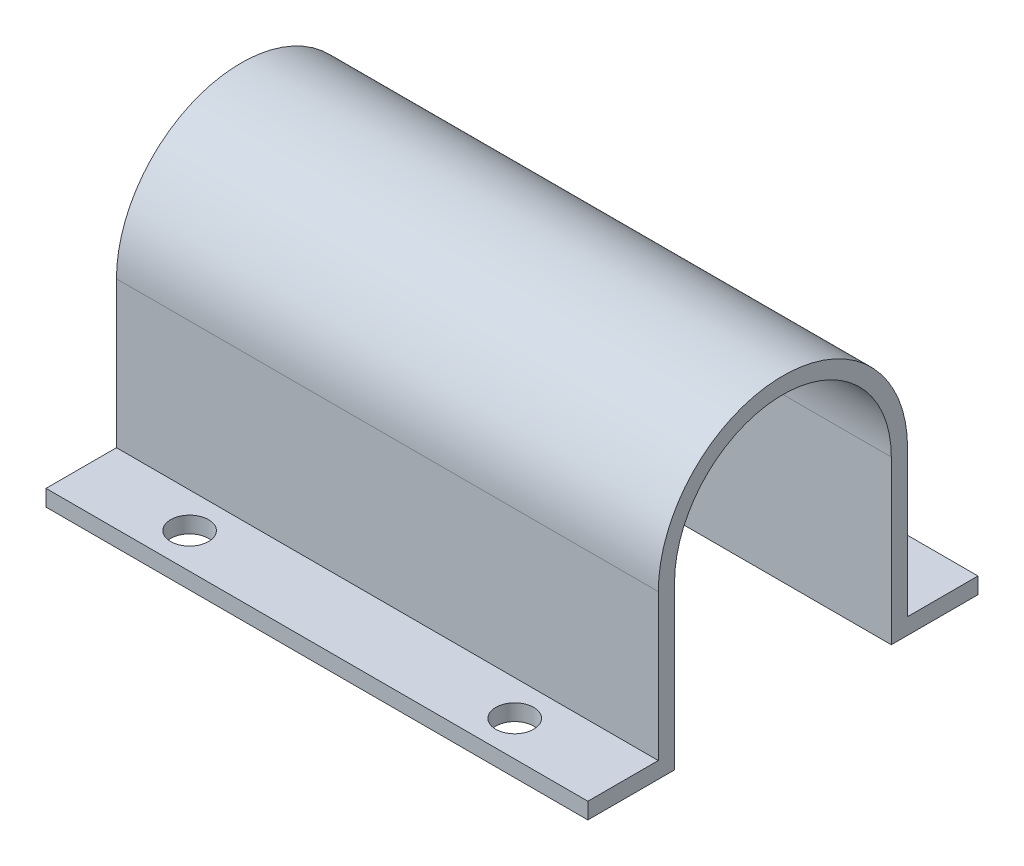
ISO-10303-21;
HEADER;
FILE_DESCRIPTION(('STEP AP214'),'2;1');
FILE_NAME('part.step','',(''),(''),'','','');
FILE_SCHEMA(('AUTOMOTIVE_DESIGN { 1 0 10303 214 1 1 1 1 }'));
ENDSEC;
DATA;
#1=APPLICATION_CONTEXT('core data for automotive mechanical design processes');
#2=APPLICATION_PROTOCOL_DEFINITION('international standard','automotive_design',2000,#1);
#3=PRODUCT_CONTEXT('',#1,'mechanical');
#4=PRODUCT('Part','Part','',(#3));
#5=PRODUCT_RELATED_PRODUCT_CATEGORY('part','',(#4));
#6=PRODUCT_DEFINITION_FORMATION('','',#4);
#7=PRODUCT_DEFINITION_CONTEXT('part definition',#1,'design');
#8=PRODUCT_DEFINITION('design','',#6,#7);
#9=PRODUCT_DEFINITION_SHAPE('','',#8);
#10=(LENGTH_UNIT() NAMED_UNIT(*) SI_UNIT(.MILLI.,.METRE.));
#11=(NAMED_UNIT(*) PLANE_ANGLE_UNIT() SI_UNIT($,.RADIAN.));
#12=(NAMED_UNIT(*) SI_UNIT($,.STERADIAN.) SOLID_ANGLE_UNIT());
#13=UNCERTAINTY_MEASURE_WITH_UNIT(LENGTH_MEASURE(1.E-05),#10,'distance_accuracy_value','');
#14=(GEOMETRIC_REPRESENTATION_CONTEXT(3) GLOBAL_UNCERTAINTY_ASSIGNED_CONTEXT((#13)) GLOBAL_UNIT_ASSIGNED_CONTEXT((#10,
#11,#12)) REPRESENTATION_CONTEXT('',''));
#15=CARTESIAN_POINT('',(0.,0.,0.));
#16=DIRECTION('',(0.,0.,1.));
#17=DIRECTION('',(1.,0.,0.));
#18=AXIS2_PLACEMENT_3D('',#15,#16,#17);
#19=CARTESIAN_POINT('',(25.,15.,11.5));
#20=DIRECTION('',(0.,0.,-1.));
#21=DIRECTION('',(-1.,0.,0.));
#22=AXIS2_PLACEMENT_3D('',#19,#20,#21);
#23=PLANE('',#22);
#24=DIRECTION('',(0.,-1.,0.));
#25=VECTOR('',#24,1.);
#26=CARTESIAN_POINT('',(-25.,15.,11.5));
#27=LINE('',#26,#25);
#28=CARTESIAN_POINT('',(-25.,15.,11.5));
#29=VERTEX_POINT('',#28);
#30=CARTESIAN_POINT('',(-25.,1.5,11.5));
#31=VERTEX_POINT('',#30);
#32=EDGE_CURVE('E157',#29,#31,#27,.T.);
#33=ORIENTED_EDGE('',*,*,#32,.T.);
#34=DIRECTION('',(-1.,0.,0.));
#35=VECTOR('',#34,1.);
#36=CARTESIAN_POINT('',(25.,1.5,11.5));
#37=LINE('',#36,#35);
#38=CARTESIAN_POINT('',(25.,1.5,11.5));
#39=VERTEX_POINT('',#38);
#40=EDGE_CURVE('E11',#39,#31,#37,.T.);
#41=ORIENTED_EDGE('',*,*,#40,.F.);
#42=DIRECTION('',(0.,-1.,0.));
#43=VECTOR('',#42,1.);
#44=CARTESIAN_POINT('',(25.,15.,11.5));
#45=LINE('',#44,#43);
#46=CARTESIAN_POINT('',(25.,15.,11.5));
#47=VERTEX_POINT('',#46);
#48=EDGE_CURVE('E180',#47,#39,#45,.T.);
#49=ORIENTED_EDGE('',*,*,#48,.F.);
#50=DIRECTION('',(-1.,0.,0.));
#51=VECTOR('',#50,1.);
#52=CARTESIAN_POINT('',(25.,15.,11.5));
#53=LINE('',#52,#51);
#54=EDGE_CURVE('E153',#47,#29,#53,.T.);
#55=ORIENTED_EDGE('',*,*,#54,.T.);
#56=EDGE_LOOP('',(#33,#41,#49,#55));
#57=FACE_BOUND('',#56,.T.);
#58=ADVANCED_FACE('F37',(#57),#23,.F.);
#59=CARTESIAN_POINT('',(25.,1.5,11.5));
#60=DIRECTION('',(0.,-1.,0.));
#61=DIRECTION('',(0.,0.,-1.));
#62=AXIS2_PLACEMENT_3D('',#59,#60,#61);
#63=PLANE('',#62);
#64=CARTESIAN_POINT('',(15.,1.5,14.75));
#65=DIRECTION('',(0.,-1.,0.));
#66=DIRECTION('',(0.,0.,1.));
#67=AXIS2_PLACEMENT_3D('',#64,#65,#66);
#68=CIRCLE('',#67,1.75);
#69=CARTESIAN_POINT('',(15.,1.5,16.5));
#70=VERTEX_POINT('',#69);
#71=EDGE_CURVE('E323',#70,#70,#68,.T.);
#72=ORIENTED_EDGE('',*,*,#71,.T.);
#73=EDGE_LOOP('',(#72));
#74=FACE_BOUND('',#73,.T.);
#75=CARTESIAN_POINT('',(-15.,1.5,14.75));
#76=DIRECTION('',(0.,1.,0.));
#77=DIRECTION('',(0.,0.,1.));
#78=AXIS2_PLACEMENT_3D('',#75,#76,#77);
#79=CIRCLE('',#78,1.75);
#80=CARTESIAN_POINT('',(-15.,1.5,16.5));
#81=VERTEX_POINT('',#80);
#82=EDGE_CURVE('E300',#81,#81,#79,.T.);
#83=ORIENTED_EDGE('',*,*,#82,.F.);
#84=EDGE_LOOP('',(#83));
#85=FACE_BOUND('',#84,.T.);
#86=DIRECTION('',(0.,0.,1.));
#87=VECTOR('',#86,1.);
#88=CARTESIAN_POINT('',(-25.,1.5,11.5));
#89=LINE('',#88,#87);
#90=CARTESIAN_POINT('',(-25.,1.5,18.));
#91=VERTEX_POINT('',#90);
#92=EDGE_CURVE('E160',#31,#91,#89,.T.);
#93=ORIENTED_EDGE('',*,*,#92,.T.);
#94=DIRECTION('',(-1.,0.,0.));
#95=VECTOR('',#94,1.);
#96=CARTESIAN_POINT('',(25.,1.5,18.));
#97=LINE('',#96,#95);
#98=CARTESIAN_POINT('',(25.,1.5,18.));
#99=VERTEX_POINT('',#98);
#100=EDGE_CURVE('E45',#99,#91,#97,.T.);
#101=ORIENTED_EDGE('',*,*,#100,.F.);
#102=DIRECTION('',(0.,0.,1.));
#103=VECTOR('',#102,1.);
#104=CARTESIAN_POINT('',(25.,1.5,11.5));
#105=LINE('',#104,#103);
#106=EDGE_CURVE('E108',#39,#99,#105,.T.);
#107=ORIENTED_EDGE('',*,*,#106,.F.);
#108=ORIENTED_EDGE('',*,*,#40,.T.);
#109=EDGE_LOOP('',(#93,#101,#107,#108));
#110=FACE_BOUND('',#109,.T.);
#111=ADVANCED_FACE('F258',(#74,#85,#110),#63,.F.);
#112=CARTESIAN_POINT('',(25.,1.5,18.));
#113=DIRECTION('',(0.,0.,-1.));
#114=DIRECTION('',(-1.,0.,0.));
#115=AXIS2_PLACEMENT_3D('',#112,#113,#114);
#116=PLANE('',#115);
#117=DIRECTION('',(0.,-1.,0.));
#118=VECTOR('',#117,1.);
#119=CARTESIAN_POINT('',(-25.,1.5,18.));
#120=LINE('',#119,#118);
#121=CARTESIAN_POINT('',(-25.,0.,18.));
#122=VERTEX_POINT('',#121);
#123=EDGE_CURVE('E163',#91,#122,#120,.T.);
#124=ORIENTED_EDGE('',*,*,#123,.T.);
#125=DIRECTION('',(-1.,0.,0.));
#126=VECTOR('',#125,1.);
#127=CARTESIAN_POINT('',(25.,0.,18.));
#128=LINE('',#127,#126);
#129=CARTESIAN_POINT('',(25.,0.,18.));
#130=VERTEX_POINT('',#129);
#131=EDGE_CURVE('E199',#130,#122,#128,.T.);
#132=ORIENTED_EDGE('',*,*,#131,.F.);
#133=DIRECTION('',(0.,-1.,0.));
#134=VECTOR('',#133,1.);
#135=CARTESIAN_POINT('',(25.,1.5,18.));
#136=LINE('',#135,#134);
#137=EDGE_CURVE('E207',#99,#130,#136,.T.);
#138=ORIENTED_EDGE('',*,*,#137,.F.);
#139=ORIENTED_EDGE('',*,*,#100,.T.);
#140=EDGE_LOOP('',(#124,#132,#138,#139));
#141=FACE_BOUND('',#140,.T.);
#142=ADVANCED_FACE('F205',(#141),#116,.F.);
#143=CARTESIAN_POINT('',(25.,0.,10.));
#144=DIRECTION('',(0.,1.,0.));
#145=DIRECTION('',(0.,0.,1.));
#146=AXIS2_PLACEMENT_3D('',#143,#144,#145);
#147=PLANE('',#146);
#148=CARTESIAN_POINT('',(15.,0.,14.75));
#149=DIRECTION('',(0.,-1.,0.));
#150=DIRECTION('',(0.,0.,1.));
#151=AXIS2_PLACEMENT_3D('',#148,#149,#150);
#152=CIRCLE('',#151,1.75);
#153=CARTESIAN_POINT('',(15.,0.,16.5));
#154=VERTEX_POINT('',#153);
#155=EDGE_CURVE('E319',#154,#154,#152,.T.);
#156=ORIENTED_EDGE('',*,*,#155,.F.);
#157=EDGE_LOOP('',(#156));
#158=FACE_BOUND('',#157,.T.);
#159=CARTESIAN_POINT('',(-15.,0.,14.75));
#160=DIRECTION('',(0.,1.,0.));
#161=DIRECTION('',(0.,0.,1.));
#162=AXIS2_PLACEMENT_3D('',#159,#160,#161);
#163=CIRCLE('',#162,1.75);
#164=CARTESIAN_POINT('',(-15.,0.,16.5));
#165=VERTEX_POINT('',#164);
#166=EDGE_CURVE('E305',#165,#165,#163,.T.);
#167=ORIENTED_EDGE('',*,*,#166,.T.);
#168=EDGE_LOOP('',(#167));
#169=FACE_BOUND('',#168,.T.);
#170=DIRECTION('',(0.,0.,-1.));
#171=VECTOR('',#170,1.);
#172=CARTESIAN_POINT('',(-25.,0.,10.));
#173=LINE('',#172,#171);
#174=CARTESIAN_POINT('',(-25.,0.,10.));
#175=VERTEX_POINT('',#174);
#176=EDGE_CURVE('E165',#122,#175,#173,.T.);
#177=ORIENTED_EDGE('',*,*,#176,.T.);
#178=DIRECTION('',(-1.,0.,0.));
#179=VECTOR('',#178,1.);
#180=CARTESIAN_POINT('',(25.,0.,10.));
#181=LINE('',#180,#179);
#182=CARTESIAN_POINT('',(25.,0.,10.));
#183=VERTEX_POINT('',#182);
#184=EDGE_CURVE('E196',#183,#175,#181,.T.);
#185=ORIENTED_EDGE('',*,*,#184,.F.);
#186=DIRECTION('',(0.,0.,-1.));
#187=VECTOR('',#186,1.);
#188=CARTESIAN_POINT('',(25.,0.,10.));
#189=LINE('',#188,#187);
#190=EDGE_CURVE('E225',#130,#183,#189,.T.);
#191=ORIENTED_EDGE('',*,*,#190,.F.);
#192=ORIENTED_EDGE('',*,*,#131,.T.);
#193=EDGE_LOOP('',(#177,#185,#191,#192));
#194=FACE_BOUND('',#193,.T.);
#195=ADVANCED_FACE('F216',(#158,#169,#194),#147,.F.);
#196=CARTESIAN_POINT('',(25.,15.,10.));
#197=DIRECTION('',(0.,0.,1.));
#198=DIRECTION('',(0.,-1.,0.));
#199=AXIS2_PLACEMENT_3D('',#196,#197,#198);
#200=PLANE('',#199);
#201=DIRECTION('',(0.,1.,0.));
#202=VECTOR('',#201,1.);
#203=CARTESIAN_POINT('',(-25.,15.,10.));
#204=LINE('',#203,#202);
#205=CARTESIAN_POINT('',(-25.,15.,10.));
#206=VERTEX_POINT('',#205);
#207=EDGE_CURVE('E167',#175,#206,#204,.T.);
#208=ORIENTED_EDGE('',*,*,#207,.T.);
#209=DIRECTION('',(-1.,0.,0.));
#210=VECTOR('',#209,1.);
#211=CARTESIAN_POINT('',(25.,15.,10.));
#212=LINE('',#211,#210);
#213=CARTESIAN_POINT('',(25.,15.,10.));
#214=VERTEX_POINT('',#213);
#215=EDGE_CURVE('E193',#214,#206,#212,.T.);
#216=ORIENTED_EDGE('',*,*,#215,.F.);
#217=DIRECTION('',(0.,1.,0.));
#218=VECTOR('',#217,1.);
#219=CARTESIAN_POINT('',(25.,15.,10.));
#220=LINE('',#219,#218);
#221=EDGE_CURVE('E222',#183,#214,#220,.T.);
#222=ORIENTED_EDGE('',*,*,#221,.F.);
#223=ORIENTED_EDGE('',*,*,#184,.T.);
#224=EDGE_LOOP('',(#208,#216,#222,#223));
#225=FACE_BOUND('',#224,.T.);
#226=ADVANCED_FACE('F220',(#225),#200,.F.);
#227=CARTESIAN_POINT('',(25.,15.,0.));
#228=DIRECTION('',(-1.,0.,0.));
#229=DIRECTION('',(0.,0.,1.));
#230=AXIS2_PLACEMENT_3D('',#227,#228,#229);
#231=CYLINDRICAL_SURFACE('',#230,10.);
#232=CARTESIAN_POINT('',(-25.,15.,0.));
#233=DIRECTION('',(-1.,0.,0.));
#234=DIRECTION('',(0.,0.,-1.));
#235=AXIS2_PLACEMENT_3D('',#232,#233,#234);
#236=CIRCLE('',#235,10.);
#237=CARTESIAN_POINT('',(-25.,15.,-10.));
#238=VERTEX_POINT('',#237);
#239=EDGE_CURVE('E169',#206,#238,#236,.T.);
#240=ORIENTED_EDGE('',*,*,#239,.T.);
#241=DIRECTION('',(-1.,0.,0.));
#242=VECTOR('',#241,1.);
#243=CARTESIAN_POINT('',(25.,15.,-10.));
#244=LINE('',#243,#242);
#245=CARTESIAN_POINT('',(25.,15.,-10.));
#246=VERTEX_POINT('',#245);
#247=EDGE_CURVE('E190',#246,#238,#244,.T.);
#248=ORIENTED_EDGE('',*,*,#247,.F.);
#249=CARTESIAN_POINT('',(25.,15.,0.));
#250=DIRECTION('',(-1.,0.,0.));
#251=DIRECTION('',(0.,0.,-1.));
#252=AXIS2_PLACEMENT_3D('',#249,#250,#251);
#253=CIRCLE('',#252,10.);
#254=EDGE_CURVE('E224',#214,#246,#253,.T.);
#255=ORIENTED_EDGE('',*,*,#254,.F.);
#256=ORIENTED_EDGE('',*,*,#215,.T.);
#257=EDGE_LOOP('',(#240,#248,#255,#256));
#258=FACE_BOUND('',#257,.T.);
#259=ADVANCED_FACE('F275',(#258),#231,.F.);
#260=CARTESIAN_POINT('',(25.,15.,-10.));
#261=DIRECTION('',(0.,0.,-1.));
#262=DIRECTION('',(0.,1.,0.));
#263=AXIS2_PLACEMENT_3D('',#260,#261,#262);
#264=PLANE('',#263);
#265=DIRECTION('',(0.,-1.,0.));
#266=VECTOR('',#265,1.);
#267=CARTESIAN_POINT('',(-25.,15.,-10.));
#268=LINE('',#267,#266);
#269=CARTESIAN_POINT('',(-25.,0.,-10.));
#270=VERTEX_POINT('',#269);
#271=EDGE_CURVE('E171',#238,#270,#268,.T.);
#272=ORIENTED_EDGE('',*,*,#271,.T.);
#273=DIRECTION('',(-1.,0.,0.));
#274=VECTOR('',#273,1.);
#275=CARTESIAN_POINT('',(25.,0.,-10.));
#276=LINE('',#275,#274);
#277=CARTESIAN_POINT('',(25.,0.,-10.));
#278=VERTEX_POINT('',#277);
#279=EDGE_CURVE('E187',#278,#270,#276,.T.);
#280=ORIENTED_EDGE('',*,*,#279,.F.);
#281=DIRECTION('',(0.,-1.,0.));
#282=VECTOR('',#281,1.);
#283=CARTESIAN_POINT('',(25.,15.,-10.));
#284=LINE('',#283,#282);
#285=EDGE_CURVE('E227',#246,#278,#284,.T.);
#286=ORIENTED_EDGE('',*,*,#285,.F.);
#287=ORIENTED_EDGE('',*,*,#247,.T.);
#288=EDGE_LOOP('',(#272,#280,#286,#287));
#289=FACE_BOUND('',#288,.T.);
#290=ADVANCED_FACE('F278',(#289),#264,.F.);
#291=CARTESIAN_POINT('',(25.,0.,-10.));
#292=DIRECTION('',(0.,1.,0.));
#293=DIRECTION('',(0.,0.,1.));
#294=AXIS2_PLACEMENT_3D('',#291,#292,#293);
#295=PLANE('',#294);
#296=CARTESIAN_POINT('',(15.,0.,-14.75));
#297=DIRECTION('',(0.,-1.,0.));
#298=DIRECTION('',(0.,0.,1.));
#299=AXIS2_PLACEMENT_3D('',#296,#297,#298);
#300=CIRCLE('',#299,1.75);
#301=CARTESIAN_POINT('',(15.,0.,-13.));
#302=VERTEX_POINT('',#301);
#303=EDGE_CURVE('E311',#302,#302,#300,.T.);
#304=ORIENTED_EDGE('',*,*,#303,.F.);
#305=EDGE_LOOP('',(#304));
#306=FACE_BOUND('',#305,.T.);
#307=CARTESIAN_POINT('',(-15.,0.,-14.75));
#308=DIRECTION('',(0.,1.,0.));
#309=DIRECTION('',(0.,0.,1.));
#310=AXIS2_PLACEMENT_3D('',#307,#308,#309);
#311=CIRCLE('',#310,1.75);
#312=CARTESIAN_POINT('',(-15.,0.,-13.));
#313=VERTEX_POINT('',#312);
#314=EDGE_CURVE('E161',#313,#313,#311,.T.);
#315=ORIENTED_EDGE('',*,*,#314,.T.);
#316=EDGE_LOOP('',(#315));
#317=FACE_BOUND('',#316,.T.);
#318=DIRECTION('',(0.,0.,-1.));
#319=VECTOR('',#318,1.);
#320=CARTESIAN_POINT('',(-25.,0.,-10.));
#321=LINE('',#320,#319);
#322=CARTESIAN_POINT('',(-25.,0.,-18.));
#323=VERTEX_POINT('',#322);
#324=EDGE_CURVE('E173',#270,#323,#321,.T.);
#325=ORIENTED_EDGE('',*,*,#324,.T.);
#326=DIRECTION('',(-1.,0.,0.));
#327=VECTOR('',#326,1.);
#328=CARTESIAN_POINT('',(25.,0.,-18.));
#329=LINE('',#328,#327);
#330=CARTESIAN_POINT('',(25.,0.,-18.));
#331=VERTEX_POINT('',#330);
#332=EDGE_CURVE('E184',#331,#323,#329,.T.);
#333=ORIENTED_EDGE('',*,*,#332,.F.);
#334=DIRECTION('',(0.,0.,-1.));
#335=VECTOR('',#334,1.);
#336=CARTESIAN_POINT('',(25.,0.,-10.));
#337=LINE('',#336,#335);
#338=EDGE_CURVE('E233',#278,#331,#337,.T.);
#339=ORIENTED_EDGE('',*,*,#338,.F.);
#340=ORIENTED_EDGE('',*,*,#279,.T.);
#341=EDGE_LOOP('',(#325,#333,#339,#340));
#342=FACE_BOUND('',#341,.T.);
#343=ADVANCED_FACE('F239',(#306,#317,#342),#295,.F.);
#344=CARTESIAN_POINT('',(25.,1.5,-18.));
#345=DIRECTION('',(0.,0.,1.));
#346=DIRECTION('',(1.,0.,0.));
#347=AXIS2_PLACEMENT_3D('',#344,#345,#346);
#348=PLANE('',#347);
#349=DIRECTION('',(0.,1.,0.));
#350=VECTOR('',#349,1.);
#351=CARTESIAN_POINT('',(-25.,1.5,-18.));
#352=LINE('',#351,#350);
#353=CARTESIAN_POINT('',(-25.,1.5,-18.));
#354=VERTEX_POINT('',#353);
#355=EDGE_CURVE('E175',#323,#354,#352,.T.);
#356=ORIENTED_EDGE('',*,*,#355,.T.);
#357=DIRECTION('',(-1.,0.,0.));
#358=VECTOR('',#357,1.);
#359=CARTESIAN_POINT('',(25.,1.5,-18.));
#360=LINE('',#359,#358);
#361=CARTESIAN_POINT('',(25.,1.5,-18.));
#362=VERTEX_POINT('',#361);
#363=EDGE_CURVE('E148',#362,#354,#360,.T.);
#364=ORIENTED_EDGE('',*,*,#363,.F.);
#365=DIRECTION('',(0.,1.,0.));
#366=VECTOR('',#365,1.);
#367=CARTESIAN_POINT('',(25.,1.5,-18.));
#368=LINE('',#367,#366);
#369=EDGE_CURVE('E139',#331,#362,#368,.T.);
#370=ORIENTED_EDGE('',*,*,#369,.F.);
#371=ORIENTED_EDGE('',*,*,#332,.T.);
#372=EDGE_LOOP('',(#356,#364,#370,#371));
#373=FACE_BOUND('',#372,.T.);
#374=ADVANCED_FACE('F243',(#373),#348,.F.);
#375=CARTESIAN_POINT('',(25.,1.5,-11.5));
#376=DIRECTION('',(0.,-1.,0.));
#377=DIRECTION('',(0.,0.,-1.));
#378=AXIS2_PLACEMENT_3D('',#375,#376,#377);
#379=PLANE('',#378);
#380=CARTESIAN_POINT('',(15.,1.5,-14.75));
#381=DIRECTION('',(0.,-1.,0.));
#382=DIRECTION('',(0.,0.,1.));
#383=AXIS2_PLACEMENT_3D('',#380,#381,#382);
#384=CIRCLE('',#383,1.75);
#385=CARTESIAN_POINT('',(15.,1.5,-13.));
#386=VERTEX_POINT('',#385);
#387=EDGE_CURVE('E295',#386,#386,#384,.T.);
#388=ORIENTED_EDGE('',*,*,#387,.T.);
#389=EDGE_LOOP('',(#388));
#390=FACE_BOUND('',#389,.T.);
#391=CARTESIAN_POINT('',(-15.,1.5,-14.75));
#392=DIRECTION('',(0.,1.,0.));
#393=DIRECTION('',(0.,0.,1.));
#394=AXIS2_PLACEMENT_3D('',#391,#392,#393);
#395=CIRCLE('',#394,1.75);
#396=CARTESIAN_POINT('',(-15.,1.5,-13.));
#397=VERTEX_POINT('',#396);
#398=EDGE_CURVE('E298',#397,#397,#395,.T.);
#399=ORIENTED_EDGE('',*,*,#398,.F.);
#400=EDGE_LOOP('',(#399));
#401=FACE_BOUND('',#400,.T.);
#402=DIRECTION('',(0.,0.,1.));
#403=VECTOR('',#402,1.);
#404=CARTESIAN_POINT('',(-25.,1.5,-11.5));
#405=LINE('',#404,#403);
#406=CARTESIAN_POINT('',(-25.,1.5,-11.5));
#407=VERTEX_POINT('',#406);
#408=EDGE_CURVE('E147',#354,#407,#405,.T.);
#409=ORIENTED_EDGE('',*,*,#408,.T.);
#410=DIRECTION('',(-1.,0.,0.));
#411=VECTOR('',#410,1.);
#412=CARTESIAN_POINT('',(25.,1.5,-11.5));
#413=LINE('',#412,#411);
#414=CARTESIAN_POINT('',(25.,1.5,-11.5));
#415=VERTEX_POINT('',#414);
#416=EDGE_CURVE('E144',#415,#407,#413,.T.);
#417=ORIENTED_EDGE('',*,*,#416,.F.);
#418=DIRECTION('',(0.,0.,1.));
#419=VECTOR('',#418,1.);
#420=CARTESIAN_POINT('',(25.,1.5,-11.5));
#421=LINE('',#420,#419);
#422=EDGE_CURVE('E133',#362,#415,#421,.T.);
#423=ORIENTED_EDGE('',*,*,#422,.F.);
#424=ORIENTED_EDGE('',*,*,#363,.T.);
#425=EDGE_LOOP('',(#409,#417,#423,#424));
#426=FACE_BOUND('',#425,.T.);
#427=ADVANCED_FACE('F145',(#390,#401,#426),#379,.F.);
#428=CARTESIAN_POINT('',(25.,15.,-11.5));
#429=DIRECTION('',(0.,0.,1.));
#430=DIRECTION('',(1.,0.,0.));
#431=AXIS2_PLACEMENT_3D('',#428,#429,#430);
#432=PLANE('',#431);
#433=DIRECTION('',(0.,1.,0.));
#434=VECTOR('',#433,1.);
#435=CARTESIAN_POINT('',(-25.,15.,-11.5));
#436=LINE('',#435,#434);
#437=CARTESIAN_POINT('',(-25.,15.,-11.5));
#438=VERTEX_POINT('',#437);
#439=EDGE_CURVE('E94',#407,#438,#436,.T.);
#440=ORIENTED_EDGE('',*,*,#439,.T.);
#441=DIRECTION('',(-1.,0.,0.));
#442=VECTOR('',#441,1.);
#443=CARTESIAN_POINT('',(25.,15.,-11.5));
#444=LINE('',#443,#442);
#445=CARTESIAN_POINT('',(25.,15.,-11.5));
#446=VERTEX_POINT('',#445);
#447=EDGE_CURVE('E149',#446,#438,#444,.T.);
#448=ORIENTED_EDGE('',*,*,#447,.F.);
#449=DIRECTION('',(0.,1.,0.));
#450=VECTOR('',#449,1.);
#451=CARTESIAN_POINT('',(25.,15.,-11.5));
#452=LINE('',#451,#450);
#453=EDGE_CURVE('E137',#415,#446,#452,.T.);
#454=ORIENTED_EDGE('',*,*,#453,.F.);
#455=ORIENTED_EDGE('',*,*,#416,.T.);
#456=EDGE_LOOP('',(#440,#448,#454,#455));
#457=FACE_BOUND('',#456,.T.);
#458=ADVANCED_FACE('F151',(#457),#432,.F.);
#459=CARTESIAN_POINT('',(25.,15.,0.));
#460=DIRECTION('',(-1.,0.,0.));
#461=DIRECTION('',(0.,0.,1.));
#462=AXIS2_PLACEMENT_3D('',#459,#460,#461);
#463=CYLINDRICAL_SURFACE('',#462,11.5);
#464=CARTESIAN_POINT('',(-25.,15.,0.));
#465=DIRECTION('',(1.,0.,0.));
#466=DIRECTION('',(0.,0.,-1.));
#467=AXIS2_PLACEMENT_3D('',#464,#465,#466);
#468=CIRCLE('',#467,11.5);
#469=EDGE_CURVE('E100',#438,#29,#468,.T.);
#470=ORIENTED_EDGE('',*,*,#469,.T.);
#471=ORIENTED_EDGE('',*,*,#54,.F.);
#472=CARTESIAN_POINT('',(25.,15.,0.));
#473=DIRECTION('',(1.,0.,0.));
#474=DIRECTION('',(0.,0.,-1.));
#475=AXIS2_PLACEMENT_3D('',#472,#473,#474);
#476=CIRCLE('',#475,11.5);
#477=EDGE_CURVE('E53',#446,#47,#476,.T.);
#478=ORIENTED_EDGE('',*,*,#477,.F.);
#479=ORIENTED_EDGE('',*,*,#447,.T.);
#480=EDGE_LOOP('',(#470,#471,#478,#479));
#481=FACE_BOUND('',#480,.T.);
#482=ADVANCED_FACE('F247',(#481),#463,.T.);
#483=CARTESIAN_POINT('',(25.,15.,0.));
#484=DIRECTION('',(1.,0.,0.));
#485=DIRECTION('',(0.,0.,-1.));
#486=AXIS2_PLACEMENT_3D('',#483,#484,#485);
#487=PLANE('',#486);
#488=ORIENTED_EDGE('',*,*,#48,.T.);
#489=ORIENTED_EDGE('',*,*,#106,.T.);
#490=ORIENTED_EDGE('',*,*,#137,.T.);
#491=ORIENTED_EDGE('',*,*,#190,.T.);
#492=ORIENTED_EDGE('',*,*,#221,.T.);
#493=ORIENTED_EDGE('',*,*,#254,.T.);
#494=ORIENTED_EDGE('',*,*,#285,.T.);
#495=ORIENTED_EDGE('',*,*,#338,.T.);
#496=ORIENTED_EDGE('',*,*,#369,.T.);
#497=ORIENTED_EDGE('',*,*,#422,.T.);
#498=ORIENTED_EDGE('',*,*,#453,.T.);
#499=ORIENTED_EDGE('',*,*,#477,.T.);
#500=EDGE_LOOP('',(#488,#489,#490,#491,#492,#493,#494,#495,#496,#497,#498,#499));
#501=FACE_BOUND('',#500,.T.);
#502=ADVANCED_FACE('F135',(#501),#487,.T.);
#503=CARTESIAN_POINT('',(-25.,15.,0.));
#504=DIRECTION('',(1.,0.,0.));
#505=DIRECTION('',(0.,0.,-1.));
#506=AXIS2_PLACEMENT_3D('',#503,#504,#505);
#507=PLANE('',#506);
#508=ORIENTED_EDGE('',*,*,#32,.F.);
#509=ORIENTED_EDGE('',*,*,#469,.F.);
#510=ORIENTED_EDGE('',*,*,#439,.F.);
#511=ORIENTED_EDGE('',*,*,#408,.F.);
#512=ORIENTED_EDGE('',*,*,#355,.F.);
#513=ORIENTED_EDGE('',*,*,#324,.F.);
#514=ORIENTED_EDGE('',*,*,#271,.F.);
#515=ORIENTED_EDGE('',*,*,#239,.F.);
#516=ORIENTED_EDGE('',*,*,#207,.F.);
#517=ORIENTED_EDGE('',*,*,#176,.F.);
#518=ORIENTED_EDGE('',*,*,#123,.F.);
#519=ORIENTED_EDGE('',*,*,#92,.F.);
#520=EDGE_LOOP('',(#508,#509,#510,#511,#512,#513,#514,#515,#516,#517,#518,#519));
#521=FACE_BOUND('',#520,.T.);
#522=ADVANCED_FACE('F211',(#521),#507,.F.);
#523=CARTESIAN_POINT('',(-15.,0.,-14.75));
#524=DIRECTION('',(0.,1.,0.));
#525=DIRECTION('',(0.,0.,1.));
#526=AXIS2_PLACEMENT_3D('',#523,#524,#525);
#527=CYLINDRICAL_SURFACE('',#526,1.75);
#528=ORIENTED_EDGE('',*,*,#314,.F.);
#529=EDGE_LOOP('',(#528));
#530=FACE_BOUND('',#529,.T.);
#531=ORIENTED_EDGE('',*,*,#398,.T.);
#532=EDGE_LOOP('',(#531));
#533=FACE_BOUND('',#532,.T.);
#534=ADVANCED_FACE('F337',(#530,#533),#527,.F.);
#535=CARTESIAN_POINT('',(-15.,0.,14.75));
#536=DIRECTION('',(0.,1.,0.));
#537=DIRECTION('',(0.,0.,1.));
#538=AXIS2_PLACEMENT_3D('',#535,#536,#537);
#539=CYLINDRICAL_SURFACE('',#538,1.75);
#540=ORIENTED_EDGE('',*,*,#166,.F.);
#541=EDGE_LOOP('',(#540));
#542=FACE_BOUND('',#541,.T.);
#543=ORIENTED_EDGE('',*,*,#82,.T.);
#544=EDGE_LOOP('',(#543));
#545=FACE_BOUND('',#544,.T.);
#546=ADVANCED_FACE('F334',(#542,#545),#539,.F.);
#547=CARTESIAN_POINT('',(15.,0.,-14.75));
#548=DIRECTION('',(0.,1.,0.));
#549=DIRECTION('',(0.,0.,1.));
#550=AXIS2_PLACEMENT_3D('',#547,#548,#549);
#551=CYLINDRICAL_SURFACE('',#550,1.75);
#552=ORIENTED_EDGE('',*,*,#303,.T.);
#553=EDGE_LOOP('',(#552));
#554=FACE_BOUND('',#553,.T.);
#555=ORIENTED_EDGE('',*,*,#387,.F.);
#556=EDGE_LOOP('',(#555));
#557=FACE_BOUND('',#556,.T.);
#558=ADVANCED_FACE('F328',(#554,#557),#551,.F.);
#559=CARTESIAN_POINT('',(15.,0.,14.75));
#560=DIRECTION('',(0.,1.,0.));
#561=DIRECTION('',(0.,0.,1.));
#562=AXIS2_PLACEMENT_3D('',#559,#560,#561);
#563=CYLINDRICAL_SURFACE('',#562,1.75);
#564=ORIENTED_EDGE('',*,*,#155,.T.);
#565=EDGE_LOOP('',(#564));
#566=FACE_BOUND('',#565,.T.);
#567=ORIENTED_EDGE('',*,*,#71,.F.);
#568=EDGE_LOOP('',(#567));
#569=FACE_BOUND('',#568,.T.);
#570=ADVANCED_FACE('F326',(#566,#569),#563,.F.);
#571=CLOSED_SHELL('',(#58,#111,#142,#195,#226,#259,#290,#343,#374,#427,#458,#482,#502,#522,#534,
#546,#558,#570));
#572=MANIFOLD_SOLID_BREP('B2',#571);
#573=ADVANCED_BREP_SHAPE_REPRESENTATION('',(#18,#572),#14);
#574=SHAPE_DEFINITION_REPRESENTATION(#9,#573);
ENDSEC;
END-ISO-10303-21;
